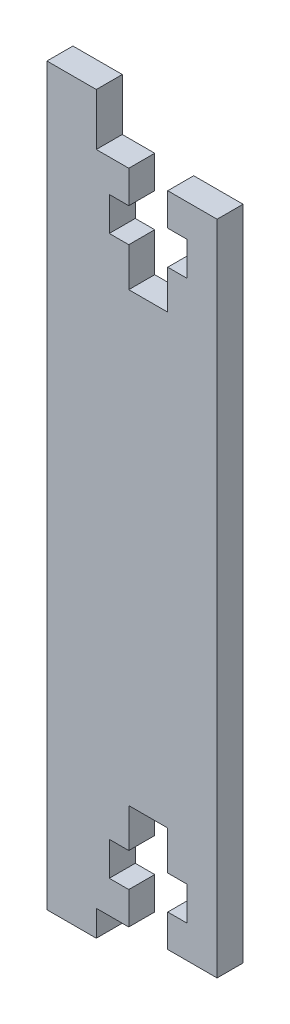
ISO-10303-21;
HEADER;
FILE_DESCRIPTION(('STEP AP214'),'2;1');
FILE_NAME('part.step','',(''),(''),'','','');
FILE_SCHEMA(('AUTOMOTIVE_DESIGN { 1 0 10303 214 1 1 1 1 }'));
ENDSEC;
DATA;
#1=APPLICATION_CONTEXT('core data for automotive mechanical design processes');
#2=APPLICATION_PROTOCOL_DEFINITION('international standard','automotive_design',2000,#1);
#3=PRODUCT_CONTEXT('',#1,'mechanical');
#4=PRODUCT('Part','Part','',(#3));
#5=PRODUCT_RELATED_PRODUCT_CATEGORY('part','',(#4));
#6=PRODUCT_DEFINITION_FORMATION('','',#4);
#7=PRODUCT_DEFINITION_CONTEXT('part definition',#1,'design');
#8=PRODUCT_DEFINITION('design','',#6,#7);
#9=PRODUCT_DEFINITION_SHAPE('','',#8);
#10=(LENGTH_UNIT() NAMED_UNIT(*) SI_UNIT(.MILLI.,.METRE.));
#11=(NAMED_UNIT(*) PLANE_ANGLE_UNIT() SI_UNIT($,.RADIAN.));
#12=(NAMED_UNIT(*) SI_UNIT($,.STERADIAN.) SOLID_ANGLE_UNIT());
#13=UNCERTAINTY_MEASURE_WITH_UNIT(LENGTH_MEASURE(1.E-05),#10,'distance_accuracy_value','');
#14=(GEOMETRIC_REPRESENTATION_CONTEXT(3) GLOBAL_UNCERTAINTY_ASSIGNED_CONTEXT((#13)) GLOBAL_UNIT_ASSIGNED_CONTEXT((#10,
#11,#12)) REPRESENTATION_CONTEXT('',''));
#15=CARTESIAN_POINT('',(0.,0.,0.));
#16=DIRECTION('',(0.,0.,1.));
#17=DIRECTION('',(1.,0.,0.));
#18=AXIS2_PLACEMENT_3D('',#15,#16,#17);
#19=CARTESIAN_POINT('',(-4.01714285714236,-28.1542857142857,2.));
#20=DIRECTION('',(0.,-1.,0.));
#21=DIRECTION('',(0.,0.,-1.));
#22=AXIS2_PLACEMENT_3D('',#19,#20,#21);
#23=PLANE('',#22);
#24=DIRECTION('',(-1.,0.,0.));
#25=VECTOR('',#24,1.);
#26=CARTESIAN_POINT('',(-4.01714285714236,-28.1542857142857,0.));
#27=LINE('',#26,#25);
#28=CARTESIAN_POINT('',(-4.01714285714236,-28.1542857142857,0.));
#29=VERTEX_POINT('',#28);
#30=CARTESIAN_POINT('',(-7.81714285714236,-28.1542857142857,0.));
#31=VERTEX_POINT('',#30);
#32=EDGE_CURVE('E356',#29,#31,#27,.T.);
#33=ORIENTED_EDGE('',*,*,#32,.F.);
#34=DIRECTION('',(0.,0.,-1.));
#35=VECTOR('',#34,1.);
#36=CARTESIAN_POINT('',(-4.01714285714236,-28.1542857142857,2.));
#37=LINE('',#36,#35);
#38=CARTESIAN_POINT('',(-4.01714285714236,-28.1542857142857,2.));
#39=VERTEX_POINT('',#38);
#40=EDGE_CURVE('E46',#39,#29,#37,.T.);
#41=ORIENTED_EDGE('',*,*,#40,.F.);
#42=DIRECTION('',(-1.,0.,0.));
#43=VECTOR('',#42,1.);
#44=CARTESIAN_POINT('',(-4.01714285714236,-28.1542857142857,2.));
#45=LINE('',#44,#43);
#46=CARTESIAN_POINT('',(-7.81714285714236,-28.1542857142857,2.));
#47=VERTEX_POINT('',#46);
#48=EDGE_CURVE('E256',#39,#47,#45,.T.);
#49=ORIENTED_EDGE('',*,*,#48,.T.);
#50=DIRECTION('',(0.,0.,-1.));
#51=VECTOR('',#50,1.);
#52=CARTESIAN_POINT('',(-7.81714285714236,-28.1542857142857,2.));
#53=LINE('',#52,#51);
#54=EDGE_CURVE('E11',#47,#31,#53,.T.);
#55=ORIENTED_EDGE('',*,*,#54,.T.);
#56=EDGE_LOOP('',(#33,#41,#49,#55));
#57=FACE_BOUND('',#56,.T.);
#58=ADVANCED_FACE('F36',(#57),#23,.T.);
#59=CARTESIAN_POINT('',(-4.01714285714236,-28.1542857142857,2.));
#60=DIRECTION('',(-1.,0.,0.));
#61=DIRECTION('',(0.,0.,1.));
#62=AXIS2_PLACEMENT_3D('',#59,#60,#61);
#63=PLANE('',#62);
#64=DIRECTION('',(0.,1.,0.));
#65=VECTOR('',#64,1.);
#66=CARTESIAN_POINT('',(-4.01714285714236,-28.1542857142857,0.));
#67=LINE('',#66,#65);
#68=CARTESIAN_POINT('',(-4.01714285714236,-26.1542857142857,0.));
#69=VERTEX_POINT('',#68);
#70=EDGE_CURVE('E261',#29,#69,#67,.T.);
#71=ORIENTED_EDGE('',*,*,#70,.T.);
#72=DIRECTION('',(0.,0.,-1.));
#73=VECTOR('',#72,1.);
#74=CARTESIAN_POINT('',(-4.01714285714236,-26.1542857142857,2.));
#75=LINE('',#74,#73);
#76=CARTESIAN_POINT('',(-4.01714285714236,-26.1542857142857,2.));
#77=VERTEX_POINT('',#76);
#78=EDGE_CURVE('E259',#77,#69,#75,.T.);
#79=ORIENTED_EDGE('',*,*,#78,.F.);
#80=DIRECTION('',(0.,1.,0.));
#81=VECTOR('',#80,1.);
#82=CARTESIAN_POINT('',(-4.01714285714236,-28.1542857142857,2.));
#83=LINE('',#82,#81);
#84=EDGE_CURVE('E248',#39,#77,#83,.T.);
#85=ORIENTED_EDGE('',*,*,#84,.F.);
#86=ORIENTED_EDGE('',*,*,#40,.T.);
#87=EDGE_LOOP('',(#71,#79,#85,#86));
#88=FACE_BOUND('',#87,.T.);
#89=ADVANCED_FACE('F260',(#88),#63,.F.);
#90=CARTESIAN_POINT('',(-4.01714285714236,-26.1542857142857,2.));
#91=DIRECTION('',(0.,1.,0.));
#92=DIRECTION('',(0.,0.,1.));
#93=AXIS2_PLACEMENT_3D('',#90,#91,#92);
#94=PLANE('',#93);
#95=DIRECTION('',(1.,0.,0.));
#96=VECTOR('',#95,1.);
#97=CARTESIAN_POINT('',(-4.01714285714236,-26.1542857142857,0.));
#98=LINE('',#97,#96);
#99=CARTESIAN_POINT('',(-1.51714285714233,-26.1542857142857,0.));
#100=VERTEX_POINT('',#99);
#101=EDGE_CURVE('E353',#69,#100,#98,.T.);
#102=ORIENTED_EDGE('',*,*,#101,.T.);
#103=DIRECTION('',(0.,0.,-1.));
#104=VECTOR('',#103,1.);
#105=CARTESIAN_POINT('',(-1.51714285714233,-26.1542857142857,2.));
#106=LINE('',#105,#104);
#107=CARTESIAN_POINT('',(-1.51714285714233,-26.1542857142857,2.));
#108=VERTEX_POINT('',#107);
#109=EDGE_CURVE('E265',#108,#100,#106,.T.);
#110=ORIENTED_EDGE('',*,*,#109,.F.);
#111=DIRECTION('',(1.,0.,0.));
#112=VECTOR('',#111,1.);
#113=CARTESIAN_POINT('',(-4.01714285714236,-26.1542857142857,2.));
#114=LINE('',#113,#112);
#115=EDGE_CURVE('E253',#77,#108,#114,.T.);
#116=ORIENTED_EDGE('',*,*,#115,.F.);
#117=ORIENTED_EDGE('',*,*,#78,.T.);
#118=EDGE_LOOP('',(#102,#110,#116,#117));
#119=FACE_BOUND('',#118,.T.);
#120=ADVANCED_FACE('F267',(#119),#94,.F.);
#121=CARTESIAN_POINT('',(-1.51714285714233,-23.6542857142861,2.));
#122=DIRECTION('',(1.,0.,0.));
#123=DIRECTION('',(0.,0.,-1.));
#124=AXIS2_PLACEMENT_3D('',#121,#122,#123);
#125=PLANE('',#124);
#126=DIRECTION('',(0.,-1.,0.));
#127=VECTOR('',#126,1.);
#128=CARTESIAN_POINT('',(-1.51714285714233,-23.6542857142861,0.));
#129=LINE('',#128,#127);
#130=CARTESIAN_POINT('',(-1.51714285714233,-23.6542857142861,0.));
#131=VERTEX_POINT('',#130);
#132=EDGE_CURVE('E350',#131,#100,#129,.T.);
#133=ORIENTED_EDGE('',*,*,#132,.F.);
#134=DIRECTION('',(0.,0.,-1.));
#135=VECTOR('',#134,1.);
#136=CARTESIAN_POINT('',(-1.51714285714233,-23.6542857142861,2.));
#137=LINE('',#136,#135);
#138=CARTESIAN_POINT('',(-1.51714285714233,-23.6542857142861,2.));
#139=VERTEX_POINT('',#138);
#140=EDGE_CURVE('E361',#139,#131,#137,.T.);
#141=ORIENTED_EDGE('',*,*,#140,.F.);
#142=DIRECTION('',(0.,-1.,0.));
#143=VECTOR('',#142,1.);
#144=CARTESIAN_POINT('',(-1.51714285714233,-23.6542857142861,2.));
#145=LINE('',#144,#143);
#146=EDGE_CURVE('E269',#139,#108,#145,.T.);
#147=ORIENTED_EDGE('',*,*,#146,.T.);
#148=ORIENTED_EDGE('',*,*,#109,.T.);
#149=EDGE_LOOP('',(#133,#141,#147,#148));
#150=FACE_BOUND('',#149,.T.);
#151=ADVANCED_FACE('F440',(#150),#125,.T.);
#152=CARTESIAN_POINT('',(-1.51714285714233,-23.6542857142861,2.));
#153=DIRECTION('',(0.,-1.,0.));
#154=DIRECTION('',(0.,0.,-1.));
#155=AXIS2_PLACEMENT_3D('',#152,#153,#154);
#156=PLANE('',#155);
#157=DIRECTION('',(-1.,0.,0.));
#158=VECTOR('',#157,1.);
#159=CARTESIAN_POINT('',(-1.51714285714233,-23.6542857142861,0.));
#160=LINE('',#159,#158);
#161=CARTESIAN_POINT('',(-3.01714285714222,-23.6542857142861,0.));
#162=VERTEX_POINT('',#161);
#163=EDGE_CURVE('E348',#131,#162,#160,.T.);
#164=ORIENTED_EDGE('',*,*,#163,.T.);
#165=DIRECTION('',(0.,0.,-1.));
#166=VECTOR('',#165,1.);
#167=CARTESIAN_POINT('',(-3.01714285714222,-23.6542857142861,2.));
#168=LINE('',#167,#166);
#169=CARTESIAN_POINT('',(-3.01714285714222,-23.6542857142861,2.));
#170=VERTEX_POINT('',#169);
#171=EDGE_CURVE('E363',#170,#162,#168,.T.);
#172=ORIENTED_EDGE('',*,*,#171,.F.);
#173=DIRECTION('',(-1.,0.,0.));
#174=VECTOR('',#173,1.);
#175=CARTESIAN_POINT('',(-1.51714285714233,-23.6542857142861,2.));
#176=LINE('',#175,#174);
#177=EDGE_CURVE('E271',#139,#170,#176,.T.);
#178=ORIENTED_EDGE('',*,*,#177,.F.);
#179=ORIENTED_EDGE('',*,*,#140,.T.);
#180=EDGE_LOOP('',(#164,#172,#178,#179));
#181=FACE_BOUND('',#180,.T.);
#182=ADVANCED_FACE('F443',(#181),#156,.F.);
#183=CARTESIAN_POINT('',(-3.01714285714222,-23.6542857142861,2.));
#184=DIRECTION('',(-1.,0.,0.));
#185=DIRECTION('',(0.,0.,1.));
#186=AXIS2_PLACEMENT_3D('',#183,#184,#185);
#187=PLANE('',#186);
#188=DIRECTION('',(0.,1.,0.));
#189=VECTOR('',#188,1.);
#190=CARTESIAN_POINT('',(-3.01714285714222,-23.6542857142861,0.));
#191=LINE('',#190,#189);
#192=CARTESIAN_POINT('',(-3.01714285714222,-21.0542857142854,0.));
#193=VERTEX_POINT('',#192);
#194=EDGE_CURVE('E346',#162,#193,#191,.T.);
#195=ORIENTED_EDGE('',*,*,#194,.T.);
#196=DIRECTION('',(0.,0.,-1.));
#197=VECTOR('',#196,1.);
#198=CARTESIAN_POINT('',(-3.01714285714222,-21.0542857142854,2.));
#199=LINE('',#198,#197);
#200=CARTESIAN_POINT('',(-3.01714285714222,-21.0542857142854,2.));
#201=VERTEX_POINT('',#200);
#202=EDGE_CURVE('E366',#201,#193,#199,.T.);
#203=ORIENTED_EDGE('',*,*,#202,.F.);
#204=DIRECTION('',(0.,1.,0.));
#205=VECTOR('',#204,1.);
#206=CARTESIAN_POINT('',(-3.01714285714222,-23.6542857142861,2.));
#207=LINE('',#206,#205);
#208=EDGE_CURVE('E853',#170,#201,#207,.T.);
#209=ORIENTED_EDGE('',*,*,#208,.F.);
#210=ORIENTED_EDGE('',*,*,#171,.T.);
#211=EDGE_LOOP('',(#195,#203,#209,#210));
#212=FACE_BOUND('',#211,.T.);
#213=ADVANCED_FACE('F447',(#212),#187,.F.);
#214=CARTESIAN_POINT('',(-3.01714285714222,-21.0542857142854,2.));
#215=DIRECTION('',(0.,1.,0.));
#216=DIRECTION('',(0.,0.,1.));
#217=AXIS2_PLACEMENT_3D('',#214,#215,#216);
#218=PLANE('',#217);
#219=DIRECTION('',(1.,0.,0.));
#220=VECTOR('',#219,1.);
#221=CARTESIAN_POINT('',(-3.01714285714222,-21.0542857142854,0.));
#222=LINE('',#221,#220);
#223=CARTESIAN_POINT('',(-1.51714285712806,-21.0542857142854,0.));
#224=VERTEX_POINT('',#223);
#225=EDGE_CURVE('E344',#193,#224,#222,.T.);
#226=ORIENTED_EDGE('',*,*,#225,.T.);
#227=DIRECTION('',(0.,0.,-1.));
#228=VECTOR('',#227,1.);
#229=CARTESIAN_POINT('',(-1.51714285712806,-21.0542857142854,2.));
#230=LINE('',#229,#228);
#231=CARTESIAN_POINT('',(-1.51714285712806,-21.0542857142854,2.));
#232=VERTEX_POINT('',#231);
#233=EDGE_CURVE('E369',#232,#224,#230,.T.);
#234=ORIENTED_EDGE('',*,*,#233,.F.);
#235=DIRECTION('',(1.,0.,0.));
#236=VECTOR('',#235,1.);
#237=CARTESIAN_POINT('',(-3.01714285714222,-21.0542857142854,2.));
#238=LINE('',#237,#236);
#239=EDGE_CURVE('E850',#201,#232,#238,.T.);
#240=ORIENTED_EDGE('',*,*,#239,.F.);
#241=ORIENTED_EDGE('',*,*,#202,.T.);
#242=EDGE_LOOP('',(#226,#234,#240,#241));
#243=FACE_BOUND('',#242,.T.);
#244=ADVANCED_FACE('F451',(#243),#218,.F.);
#245=CARTESIAN_POINT('',(-1.51714285712806,-21.0542857142854,2.));
#246=DIRECTION('',(-1.,0.,0.));
#247=DIRECTION('',(0.,0.,1.));
#248=AXIS2_PLACEMENT_3D('',#245,#246,#247);
#249=PLANE('',#248);
#250=DIRECTION('',(0.,1.,0.));
#251=VECTOR('',#250,1.);
#252=CARTESIAN_POINT('',(-1.51714285712806,-21.0542857142854,0.));
#253=LINE('',#252,#251);
#254=CARTESIAN_POINT('',(-1.51714285712806,-18.0542857142858,0.));
#255=VERTEX_POINT('',#254);
#256=EDGE_CURVE('E342',#224,#255,#253,.T.);
#257=ORIENTED_EDGE('',*,*,#256,.T.);
#258=DIRECTION('',(0.,0.,-1.));
#259=VECTOR('',#258,1.);
#260=CARTESIAN_POINT('',(-1.51714285712806,-18.0542857142858,2.));
#261=LINE('',#260,#259);
#262=CARTESIAN_POINT('',(-1.51714285712806,-18.0542857142858,2.));
#263=VERTEX_POINT('',#262);
#264=EDGE_CURVE('E372',#263,#255,#261,.T.);
#265=ORIENTED_EDGE('',*,*,#264,.F.);
#266=DIRECTION('',(0.,1.,0.));
#267=VECTOR('',#266,1.);
#268=CARTESIAN_POINT('',(-1.51714285712806,-21.0542857142854,2.));
#269=LINE('',#268,#267);
#270=EDGE_CURVE('E848',#232,#263,#269,.T.);
#271=ORIENTED_EDGE('',*,*,#270,.F.);
#272=ORIENTED_EDGE('',*,*,#233,.T.);
#273=EDGE_LOOP('',(#257,#265,#271,#272));
#274=FACE_BOUND('',#273,.T.);
#275=ADVANCED_FACE('F455',(#274),#249,.F.);
#276=CARTESIAN_POINT('',(-1.51714285712806,-18.0542857142858,2.));
#277=DIRECTION('',(0.,1.,0.));
#278=DIRECTION('',(0.,0.,1.));
#279=AXIS2_PLACEMENT_3D('',#276,#277,#278);
#280=PLANE('',#279);
#281=DIRECTION('',(1.,0.,0.));
#282=VECTOR('',#281,1.);
#283=CARTESIAN_POINT('',(-1.51714285712806,-18.0542857142858,0.));
#284=LINE('',#283,#282);
#285=CARTESIAN_POINT('',(1.48285714284341,-18.0542857142858,0.));
#286=VERTEX_POINT('',#285);
#287=EDGE_CURVE('E339',#255,#286,#284,.T.);
#288=ORIENTED_EDGE('',*,*,#287,.T.);
#289=DIRECTION('',(0.,0.,-1.));
#290=VECTOR('',#289,1.);
#291=CARTESIAN_POINT('',(1.48285714284341,-18.0542857142858,2.));
#292=LINE('',#291,#290);
#293=CARTESIAN_POINT('',(1.48285714284341,-18.0542857142858,2.));
#294=VERTEX_POINT('',#293);
#295=EDGE_CURVE('E375',#294,#286,#292,.T.);
#296=ORIENTED_EDGE('',*,*,#295,.F.);
#297=DIRECTION('',(1.,0.,0.));
#298=VECTOR('',#297,1.);
#299=CARTESIAN_POINT('',(-1.51714285712806,-18.0542857142858,2.));
#300=LINE('',#299,#298);
#301=EDGE_CURVE('E862',#263,#294,#300,.T.);
#302=ORIENTED_EDGE('',*,*,#301,.F.);
#303=ORIENTED_EDGE('',*,*,#264,.T.);
#304=EDGE_LOOP('',(#288,#296,#302,#303));
#305=FACE_BOUND('',#304,.T.);
#306=ADVANCED_FACE('F459',(#305),#280,.F.);
#307=CARTESIAN_POINT('',(1.48285714284341,-21.0542857142863,2.));
#308=DIRECTION('',(-1.,0.,0.));
#309=DIRECTION('',(0.,0.,1.));
#310=AXIS2_PLACEMENT_3D('',#307,#308,#309);
#311=PLANE('',#310);
#312=DIRECTION('',(0.,1.,0.));
#313=VECTOR('',#312,1.);
#314=CARTESIAN_POINT('',(1.48285714284341,-21.0542857142863,0.));
#315=LINE('',#314,#313);
#316=CARTESIAN_POINT('',(1.48285714284341,-21.0542857142863,0.));
#317=VERTEX_POINT('',#316);
#318=EDGE_CURVE('E336',#317,#286,#315,.T.);
#319=ORIENTED_EDGE('',*,*,#318,.F.);
#320=DIRECTION('',(0.,0.,-1.));
#321=VECTOR('',#320,1.);
#322=CARTESIAN_POINT('',(1.48285714284341,-21.0542857142863,2.));
#323=LINE('',#322,#321);
#324=CARTESIAN_POINT('',(1.48285714284341,-21.0542857142863,2.));
#325=VERTEX_POINT('',#324);
#326=EDGE_CURVE('E377',#325,#317,#323,.T.);
#327=ORIENTED_EDGE('',*,*,#326,.F.);
#328=DIRECTION('',(0.,1.,0.));
#329=VECTOR('',#328,1.);
#330=CARTESIAN_POINT('',(1.48285714284341,-21.0542857142863,2.));
#331=LINE('',#330,#329);
#332=EDGE_CURVE('E840',#325,#294,#331,.T.);
#333=ORIENTED_EDGE('',*,*,#332,.T.);
#334=ORIENTED_EDGE('',*,*,#295,.T.);
#335=EDGE_LOOP('',(#319,#327,#333,#334));
#336=FACE_BOUND('',#335,.T.);
#337=ADVANCED_FACE('F463',(#336),#311,.T.);
#338=CARTESIAN_POINT('',(2.98285714285637,-21.0542857142863,2.));
#339=DIRECTION('',(0.,-1.,0.));
#340=DIRECTION('',(0.,0.,-1.));
#341=AXIS2_PLACEMENT_3D('',#338,#339,#340);
#342=PLANE('',#341);
#343=DIRECTION('',(-1.,0.,0.));
#344=VECTOR('',#343,1.);
#345=CARTESIAN_POINT('',(2.98285714285637,-21.0542857142863,0.));
#346=LINE('',#345,#344);
#347=CARTESIAN_POINT('',(2.98285714285637,-21.0542857142863,0.));
#348=VERTEX_POINT('',#347);
#349=EDGE_CURVE('E333',#348,#317,#346,.T.);
#350=ORIENTED_EDGE('',*,*,#349,.F.);
#351=DIRECTION('',(0.,0.,-1.));
#352=VECTOR('',#351,1.);
#353=CARTESIAN_POINT('',(2.98285714285637,-21.0542857142863,2.));
#354=LINE('',#353,#352);
#355=CARTESIAN_POINT('',(2.98285714285637,-21.0542857142863,2.));
#356=VERTEX_POINT('',#355);
#357=EDGE_CURVE('E379',#356,#348,#354,.T.);
#358=ORIENTED_EDGE('',*,*,#357,.F.);
#359=DIRECTION('',(-1.,0.,0.));
#360=VECTOR('',#359,1.);
#361=CARTESIAN_POINT('',(2.98285714285637,-21.0542857142863,2.));
#362=LINE('',#361,#360);
#363=EDGE_CURVE('E836',#356,#325,#362,.T.);
#364=ORIENTED_EDGE('',*,*,#363,.T.);
#365=ORIENTED_EDGE('',*,*,#326,.T.);
#366=EDGE_LOOP('',(#350,#358,#364,#365));
#367=FACE_BOUND('',#366,.T.);
#368=ADVANCED_FACE('F467',(#367),#342,.T.);
#369=CARTESIAN_POINT('',(2.98285714285637,-23.6542857142861,2.));
#370=DIRECTION('',(-1.,0.,0.));
#371=DIRECTION('',(0.,0.,1.));
#372=AXIS2_PLACEMENT_3D('',#369,#370,#371);
#373=PLANE('',#372);
#374=DIRECTION('',(0.,1.,0.));
#375=VECTOR('',#374,1.);
#376=CARTESIAN_POINT('',(2.98285714285637,-23.6542857142861,0.));
#377=LINE('',#376,#375);
#378=CARTESIAN_POINT('',(2.98285714285637,-23.6542857142861,0.));
#379=VERTEX_POINT('',#378);
#380=EDGE_CURVE('E330',#379,#348,#377,.T.);
#381=ORIENTED_EDGE('',*,*,#380,.F.);
#382=DIRECTION('',(0.,0.,-1.));
#383=VECTOR('',#382,1.);
#384=CARTESIAN_POINT('',(2.98285714285637,-23.6542857142861,2.));
#385=LINE('',#384,#383);
#386=CARTESIAN_POINT('',(2.98285714285637,-23.6542857142861,2.));
#387=VERTEX_POINT('',#386);
#388=EDGE_CURVE('E381',#387,#379,#385,.T.);
#389=ORIENTED_EDGE('',*,*,#388,.F.);
#390=DIRECTION('',(0.,1.,0.));
#391=VECTOR('',#390,1.);
#392=CARTESIAN_POINT('',(2.98285714285637,-23.6542857142861,2.));
#393=LINE('',#392,#391);
#394=EDGE_CURVE('E866',#387,#356,#393,.T.);
#395=ORIENTED_EDGE('',*,*,#394,.T.);
#396=ORIENTED_EDGE('',*,*,#357,.T.);
#397=EDGE_LOOP('',(#381,#389,#395,#396));
#398=FACE_BOUND('',#397,.T.);
#399=ADVANCED_FACE('F471',(#398),#373,.T.);
#400=CARTESIAN_POINT('',(1.48285714284341,-23.6542857142861,2.));
#401=DIRECTION('',(0.,1.,0.));
#402=DIRECTION('',(0.,0.,1.));
#403=AXIS2_PLACEMENT_3D('',#400,#401,#402);
#404=PLANE('',#403);
#405=DIRECTION('',(1.,0.,0.));
#406=VECTOR('',#405,1.);
#407=CARTESIAN_POINT('',(1.48285714284341,-23.6542857142861,0.));
#408=LINE('',#407,#406);
#409=CARTESIAN_POINT('',(1.48285714284341,-23.6542857142861,0.));
#410=VERTEX_POINT('',#409);
#411=EDGE_CURVE('E327',#410,#379,#408,.T.);
#412=ORIENTED_EDGE('',*,*,#411,.F.);
#413=DIRECTION('',(0.,0.,-1.));
#414=VECTOR('',#413,1.);
#415=CARTESIAN_POINT('',(1.48285714284341,-23.6542857142861,2.));
#416=LINE('',#415,#414);
#417=CARTESIAN_POINT('',(1.48285714284341,-23.6542857142861,2.));
#418=VERTEX_POINT('',#417);
#419=EDGE_CURVE('E383',#418,#410,#416,.T.);
#420=ORIENTED_EDGE('',*,*,#419,.F.);
#421=DIRECTION('',(1.,0.,0.));
#422=VECTOR('',#421,1.);
#423=CARTESIAN_POINT('',(1.48285714284341,-23.6542857142861,2.));
#424=LINE('',#423,#422);
#425=EDGE_CURVE('E828',#418,#387,#424,.T.);
#426=ORIENTED_EDGE('',*,*,#425,.T.);
#427=ORIENTED_EDGE('',*,*,#388,.T.);
#428=EDGE_LOOP('',(#412,#420,#426,#427));
#429=FACE_BOUND('',#428,.T.);
#430=ADVANCED_FACE('F475',(#429),#404,.T.);
#431=CARTESIAN_POINT('',(1.48285714284341,-26.1542857142857,2.));
#432=DIRECTION('',(-1.,0.,0.));
#433=DIRECTION('',(0.,0.,1.));
#434=AXIS2_PLACEMENT_3D('',#431,#432,#433);
#435=PLANE('',#434);
#436=DIRECTION('',(0.,1.,0.));
#437=VECTOR('',#436,1.);
#438=CARTESIAN_POINT('',(1.48285714284341,-26.1542857142857,0.));
#439=LINE('',#438,#437);
#440=CARTESIAN_POINT('',(1.48285714284341,-26.1542857142857,0.));
#441=VERTEX_POINT('',#440);
#442=EDGE_CURVE('E324',#441,#410,#439,.T.);
#443=ORIENTED_EDGE('',*,*,#442,.F.);
#444=DIRECTION('',(0.,0.,-1.));
#445=VECTOR('',#444,1.);
#446=CARTESIAN_POINT('',(1.48285714284341,-26.1542857142857,2.));
#447=LINE('',#446,#445);
#448=CARTESIAN_POINT('',(1.48285714284341,-26.1542857142857,2.));
#449=VERTEX_POINT('',#448);
#450=EDGE_CURVE('E385',#449,#441,#447,.T.);
#451=ORIENTED_EDGE('',*,*,#450,.F.);
#452=DIRECTION('',(0.,1.,0.));
#453=VECTOR('',#452,1.);
#454=CARTESIAN_POINT('',(1.48285714284341,-26.1542857142857,2.));
#455=LINE('',#454,#453);
#456=EDGE_CURVE('E824',#449,#418,#455,.T.);
#457=ORIENTED_EDGE('',*,*,#456,.T.);
#458=ORIENTED_EDGE('',*,*,#419,.T.);
#459=EDGE_LOOP('',(#443,#451,#457,#458));
#460=FACE_BOUND('',#459,.T.);
#461=ADVANCED_FACE('F479',(#460),#435,.T.);
#462=CARTESIAN_POINT('',(5.2828571428567,-26.1542857142857,2.));
#463=DIRECTION('',(0.,-1.,0.));
#464=DIRECTION('',(0.,0.,-1.));
#465=AXIS2_PLACEMENT_3D('',#462,#463,#464);
#466=PLANE('',#465);
#467=DIRECTION('',(-1.,0.,0.));
#468=VECTOR('',#467,1.);
#469=CARTESIAN_POINT('',(5.2828571428567,-26.1542857142857,0.));
#470=LINE('',#469,#468);
#471=CARTESIAN_POINT('',(5.2828571428567,-26.1542857142857,0.));
#472=VERTEX_POINT('',#471);
#473=EDGE_CURVE('E321',#472,#441,#470,.T.);
#474=ORIENTED_EDGE('',*,*,#473,.F.);
#475=DIRECTION('',(0.,0.,-1.));
#476=VECTOR('',#475,1.);
#477=CARTESIAN_POINT('',(5.2828571428567,-26.1542857142857,2.));
#478=LINE('',#477,#476);
#479=CARTESIAN_POINT('',(5.2828571428567,-26.1542857142857,2.));
#480=VERTEX_POINT('',#479);
#481=EDGE_CURVE('E387',#480,#472,#478,.T.);
#482=ORIENTED_EDGE('',*,*,#481,.F.);
#483=DIRECTION('',(-1.,0.,0.));
#484=VECTOR('',#483,1.);
#485=CARTESIAN_POINT('',(5.2828571428567,-26.1542857142857,2.));
#486=LINE('',#485,#484);
#487=EDGE_CURVE('E819',#480,#449,#486,.T.);
#488=ORIENTED_EDGE('',*,*,#487,.T.);
#489=ORIENTED_EDGE('',*,*,#450,.T.);
#490=EDGE_LOOP('',(#474,#482,#488,#489));
#491=FACE_BOUND('',#490,.T.);
#492=ADVANCED_FACE('F483',(#491),#466,.T.);
#493=CARTESIAN_POINT('',(5.2828571428567,-26.1542857142857,2.));
#494=DIRECTION('',(-1.,0.,0.));
#495=DIRECTION('',(0.,0.,1.));
#496=AXIS2_PLACEMENT_3D('',#493,#494,#495);
#497=PLANE('',#496);
#498=DIRECTION('',(0.,1.,0.));
#499=VECTOR('',#498,1.);
#500=CARTESIAN_POINT('',(5.2828571428567,-26.1542857142857,0.));
#501=LINE('',#500,#499);
#502=CARTESIAN_POINT('',(5.2828571428567,24.4457142857143,0.));
#503=VERTEX_POINT('',#502);
#504=EDGE_CURVE('E318',#472,#503,#501,.T.);
#505=ORIENTED_EDGE('',*,*,#504,.T.);
#506=DIRECTION('',(0.,0.,-1.));
#507=VECTOR('',#506,1.);
#508=CARTESIAN_POINT('',(5.2828571428567,24.4457142857143,2.));
#509=LINE('',#508,#507);
#510=CARTESIAN_POINT('',(5.2828571428567,24.4457142857143,2.));
#511=VERTEX_POINT('',#510);
#512=EDGE_CURVE('E389',#511,#503,#509,.T.);
#513=ORIENTED_EDGE('',*,*,#512,.F.);
#514=DIRECTION('',(0.,1.,0.));
#515=VECTOR('',#514,1.);
#516=CARTESIAN_POINT('',(5.2828571428567,-26.1542857142857,2.));
#517=LINE('',#516,#515);
#518=EDGE_CURVE('E816',#480,#511,#517,.T.);
#519=ORIENTED_EDGE('',*,*,#518,.F.);
#520=ORIENTED_EDGE('',*,*,#481,.T.);
#521=EDGE_LOOP('',(#505,#513,#519,#520));
#522=FACE_BOUND('',#521,.T.);
#523=ADVANCED_FACE('F487',(#522),#497,.F.);
#524=CARTESIAN_POINT('',(1.4828571428567,24.4457142857143,2.));
#525=DIRECTION('',(0.,1.,0.));
#526=DIRECTION('',(0.,0.,1.));
#527=AXIS2_PLACEMENT_3D('',#524,#525,#526);
#528=PLANE('',#527);
#529=DIRECTION('',(1.,0.,0.));
#530=VECTOR('',#529,1.);
#531=CARTESIAN_POINT('',(1.4828571428567,24.4457142857143,0.));
#532=LINE('',#531,#530);
#533=CARTESIAN_POINT('',(1.4828571428567,24.4457142857143,0.));
#534=VERTEX_POINT('',#533);
#535=EDGE_CURVE('E315',#534,#503,#532,.T.);
#536=ORIENTED_EDGE('',*,*,#535,.F.);
#537=DIRECTION('',(0.,0.,-1.));
#538=VECTOR('',#537,1.);
#539=CARTESIAN_POINT('',(1.4828571428567,24.4457142857143,2.));
#540=LINE('',#539,#538);
#541=CARTESIAN_POINT('',(1.4828571428567,24.4457142857143,2.));
#542=VERTEX_POINT('',#541);
#543=EDGE_CURVE('E391',#542,#534,#540,.T.);
#544=ORIENTED_EDGE('',*,*,#543,.F.);
#545=DIRECTION('',(1.,0.,0.));
#546=VECTOR('',#545,1.);
#547=CARTESIAN_POINT('',(1.4828571428567,24.4457142857143,2.));
#548=LINE('',#547,#546);
#549=EDGE_CURVE('E814',#542,#511,#548,.T.);
#550=ORIENTED_EDGE('',*,*,#549,.T.);
#551=ORIENTED_EDGE('',*,*,#512,.T.);
#552=EDGE_LOOP('',(#536,#544,#550,#551));
#553=FACE_BOUND('',#552,.T.);
#554=ADVANCED_FACE('F491',(#553),#528,.T.);
#555=CARTESIAN_POINT('',(1.4828571428567,21.9457142857147,2.));
#556=DIRECTION('',(-1.,0.,0.));
#557=DIRECTION('',(0.,0.,1.));
#558=AXIS2_PLACEMENT_3D('',#555,#556,#557);
#559=PLANE('',#558);
#560=DIRECTION('',(0.,1.,0.));
#561=VECTOR('',#560,1.);
#562=CARTESIAN_POINT('',(1.4828571428567,21.9457142857147,0.));
#563=LINE('',#562,#561);
#564=CARTESIAN_POINT('',(1.4828571428567,21.9457142857147,0.));
#565=VERTEX_POINT('',#564);
#566=EDGE_CURVE('E312',#565,#534,#563,.T.);
#567=ORIENTED_EDGE('',*,*,#566,.F.);
#568=DIRECTION('',(0.,0.,-1.));
#569=VECTOR('',#568,1.);
#570=CARTESIAN_POINT('',(1.4828571428567,21.9457142857147,2.));
#571=LINE('',#570,#569);
#572=CARTESIAN_POINT('',(1.4828571428567,21.9457142857147,2.));
#573=VERTEX_POINT('',#572);
#574=EDGE_CURVE('E393',#573,#565,#571,.T.);
#575=ORIENTED_EDGE('',*,*,#574,.F.);
#576=DIRECTION('',(0.,1.,0.));
#577=VECTOR('',#576,1.);
#578=CARTESIAN_POINT('',(1.4828571428567,21.9457142857147,2.));
#579=LINE('',#578,#577);
#580=EDGE_CURVE('E807',#573,#542,#579,.T.);
#581=ORIENTED_EDGE('',*,*,#580,.T.);
#582=ORIENTED_EDGE('',*,*,#543,.T.);
#583=EDGE_LOOP('',(#567,#575,#581,#582));
#584=FACE_BOUND('',#583,.T.);
#585=ADVANCED_FACE('F495',(#584),#559,.T.);
#586=CARTESIAN_POINT('',(1.4828571428567,21.9457142857147,2.));
#587=DIRECTION('',(0.,1.,0.));
#588=DIRECTION('',(0.,0.,1.));
#589=AXIS2_PLACEMENT_3D('',#586,#587,#588);
#590=PLANE('',#589);
#591=DIRECTION('',(1.,0.,0.));
#592=VECTOR('',#591,1.);
#593=CARTESIAN_POINT('',(1.4828571428567,21.9457142857147,0.));
#594=LINE('',#593,#592);
#595=CARTESIAN_POINT('',(2.98285714285636,21.9457142857147,0.));
#596=VERTEX_POINT('',#595);
#597=EDGE_CURVE('E310',#565,#596,#594,.T.);
#598=ORIENTED_EDGE('',*,*,#597,.T.);
#599=DIRECTION('',(0.,0.,-1.));
#600=VECTOR('',#599,1.);
#601=CARTESIAN_POINT('',(2.98285714285636,21.9457142857147,2.));
#602=LINE('',#601,#600);
#603=CARTESIAN_POINT('',(2.98285714285636,21.9457142857147,2.));
#604=VERTEX_POINT('',#603);
#605=EDGE_CURVE('E395',#604,#596,#602,.T.);
#606=ORIENTED_EDGE('',*,*,#605,.F.);
#607=DIRECTION('',(1.,0.,0.));
#608=VECTOR('',#607,1.);
#609=CARTESIAN_POINT('',(1.4828571428567,21.9457142857147,2.));
#610=LINE('',#609,#608);
#611=EDGE_CURVE('E804',#573,#604,#610,.T.);
#612=ORIENTED_EDGE('',*,*,#611,.F.);
#613=ORIENTED_EDGE('',*,*,#574,.T.);
#614=EDGE_LOOP('',(#598,#606,#612,#613));
#615=FACE_BOUND('',#614,.T.);
#616=ADVANCED_FACE('F499',(#615),#590,.F.);
#617=CARTESIAN_POINT('',(2.98285714285636,21.9457142857147,2.));
#618=DIRECTION('',(1.,0.,0.));
#619=DIRECTION('',(0.,1.,0.));
#620=AXIS2_PLACEMENT_3D('',#617,#618,#619);
#621=PLANE('',#620);
#622=DIRECTION('',(0.,-1.,0.));
#623=VECTOR('',#622,1.);
#624=CARTESIAN_POINT('',(2.98285714285636,21.9457142857147,0.));
#625=LINE('',#624,#623);
#626=CARTESIAN_POINT('',(2.98285714285637,19.3457142857149,0.));
#627=VERTEX_POINT('',#626);
#628=EDGE_CURVE('E308',#596,#627,#625,.T.);
#629=ORIENTED_EDGE('',*,*,#628,.T.);
#630=DIRECTION('',(0.,0.,-1.));
#631=VECTOR('',#630,1.);
#632=CARTESIAN_POINT('',(2.98285714285637,19.3457142857149,2.));
#633=LINE('',#632,#631);
#634=CARTESIAN_POINT('',(2.98285714285637,19.3457142857149,2.));
#635=VERTEX_POINT('',#634);
#636=EDGE_CURVE('E398',#635,#627,#633,.T.);
#637=ORIENTED_EDGE('',*,*,#636,.F.);
#638=DIRECTION('',(0.,-1.,0.));
#639=VECTOR('',#638,1.);
#640=CARTESIAN_POINT('',(2.98285714285636,21.9457142857147,2.));
#641=LINE('',#640,#639);
#642=EDGE_CURVE('E802',#604,#635,#641,.T.);
#643=ORIENTED_EDGE('',*,*,#642,.F.);
#644=ORIENTED_EDGE('',*,*,#605,.T.);
#645=EDGE_LOOP('',(#629,#637,#643,#644));
#646=FACE_BOUND('',#645,.T.);
#647=ADVANCED_FACE('F503',(#646),#621,.F.);
#648=CARTESIAN_POINT('',(2.98285714285637,19.3457142857149,2.));
#649=DIRECTION('',(0.,-1.,0.));
#650=DIRECTION('',(0.,0.,-1.));
#651=AXIS2_PLACEMENT_3D('',#648,#649,#650);
#652=PLANE('',#651);
#653=DIRECTION('',(-1.,0.,0.));
#654=VECTOR('',#653,1.);
#655=CARTESIAN_POINT('',(2.98285714285637,19.3457142857149,0.));
#656=LINE('',#655,#654);
#657=CARTESIAN_POINT('',(1.48285714284341,19.3457142857149,0.));
#658=VERTEX_POINT('',#657);
#659=EDGE_CURVE('E306',#627,#658,#656,.T.);
#660=ORIENTED_EDGE('',*,*,#659,.T.);
#661=DIRECTION('',(0.,0.,-1.));
#662=VECTOR('',#661,1.);
#663=CARTESIAN_POINT('',(1.48285714284341,19.3457142857149,2.));
#664=LINE('',#663,#662);
#665=CARTESIAN_POINT('',(1.48285714284341,19.3457142857149,2.));
#666=VERTEX_POINT('',#665);
#667=EDGE_CURVE('E401',#666,#658,#664,.T.);
#668=ORIENTED_EDGE('',*,*,#667,.F.);
#669=DIRECTION('',(-1.,0.,0.));
#670=VECTOR('',#669,1.);
#671=CARTESIAN_POINT('',(2.98285714285637,19.3457142857149,2.));
#672=LINE('',#671,#670);
#673=EDGE_CURVE('E795',#635,#666,#672,.T.);
#674=ORIENTED_EDGE('',*,*,#673,.F.);
#675=ORIENTED_EDGE('',*,*,#636,.T.);
#676=EDGE_LOOP('',(#660,#668,#674,#675));
#677=FACE_BOUND('',#676,.T.);
#678=ADVANCED_FACE('F507',(#677),#652,.F.);
#679=CARTESIAN_POINT('',(1.48285714284341,19.3457142857149,2.));
#680=DIRECTION('',(1.,0.,0.));
#681=DIRECTION('',(0.,0.,-1.));
#682=AXIS2_PLACEMENT_3D('',#679,#680,#681);
#683=PLANE('',#682);
#684=DIRECTION('',(0.,-1.,0.));
#685=VECTOR('',#684,1.);
#686=CARTESIAN_POINT('',(1.48285714284341,19.3457142857149,0.));
#687=LINE('',#686,#685);
#688=CARTESIAN_POINT('',(1.48285714284341,16.3457142857145,0.));
#689=VERTEX_POINT('',#688);
#690=EDGE_CURVE('E303',#658,#689,#687,.T.);
#691=ORIENTED_EDGE('',*,*,#690,.T.);
#692=DIRECTION('',(0.,0.,-1.));
#693=VECTOR('',#692,1.);
#694=CARTESIAN_POINT('',(1.48285714284341,16.3457142857145,2.));
#695=LINE('',#694,#693);
#696=CARTESIAN_POINT('',(1.48285714284341,16.3457142857145,2.));
#697=VERTEX_POINT('',#696);
#698=EDGE_CURVE('E404',#697,#689,#695,.T.);
#699=ORIENTED_EDGE('',*,*,#698,.F.);
#700=DIRECTION('',(0.,-1.,0.));
#701=VECTOR('',#700,1.);
#702=CARTESIAN_POINT('',(1.48285714284341,19.3457142857149,2.));
#703=LINE('',#702,#701);
#704=EDGE_CURVE('E793',#666,#697,#703,.T.);
#705=ORIENTED_EDGE('',*,*,#704,.F.);
#706=ORIENTED_EDGE('',*,*,#667,.T.);
#707=EDGE_LOOP('',(#691,#699,#705,#706));
#708=FACE_BOUND('',#707,.T.);
#709=ADVANCED_FACE('F511',(#708),#683,.F.);
#710=CARTESIAN_POINT('',(-1.51714285712806,16.3457142857145,2.));
#711=DIRECTION('',(0.,1.,0.));
#712=DIRECTION('',(-1.,0.,0.));
#713=AXIS2_PLACEMENT_3D('',#710,#711,#712);
#714=PLANE('',#713);
#715=DIRECTION('',(1.,0.,0.));
#716=VECTOR('',#715,1.);
#717=CARTESIAN_POINT('',(-1.51714285712806,16.3457142857145,0.));
#718=LINE('',#717,#716);
#719=CARTESIAN_POINT('',(-1.51714285712806,16.3457142857145,0.));
#720=VERTEX_POINT('',#719);
#721=EDGE_CURVE('E300',#720,#689,#718,.T.);
#722=ORIENTED_EDGE('',*,*,#721,.F.);
#723=DIRECTION('',(0.,0.,-1.));
#724=VECTOR('',#723,1.);
#725=CARTESIAN_POINT('',(-1.51714285712806,16.3457142857145,2.));
#726=LINE('',#725,#724);
#727=CARTESIAN_POINT('',(-1.51714285712806,16.3457142857145,2.));
#728=VERTEX_POINT('',#727);
#729=EDGE_CURVE('E406',#728,#720,#726,.T.);
#730=ORIENTED_EDGE('',*,*,#729,.F.);
#731=DIRECTION('',(1.,0.,0.));
#732=VECTOR('',#731,1.);
#733=CARTESIAN_POINT('',(-1.51714285712806,16.3457142857145,2.));
#734=LINE('',#733,#732);
#735=EDGE_CURVE('E790',#728,#697,#734,.T.);
#736=ORIENTED_EDGE('',*,*,#735,.T.);
#737=ORIENTED_EDGE('',*,*,#698,.T.);
#738=EDGE_LOOP('',(#722,#730,#736,#737));
#739=FACE_BOUND('',#738,.T.);
#740=ADVANCED_FACE('F515',(#739),#714,.T.);
#741=CARTESIAN_POINT('',(-1.51714285712806,19.345714285714,2.));
#742=DIRECTION('',(1.,0.,0.));
#743=DIRECTION('',(0.,0.,-1.));
#744=AXIS2_PLACEMENT_3D('',#741,#742,#743);
#745=PLANE('',#744);
#746=DIRECTION('',(0.,-1.,0.));
#747=VECTOR('',#746,1.);
#748=CARTESIAN_POINT('',(-1.51714285712806,19.345714285714,0.));
#749=LINE('',#748,#747);
#750=CARTESIAN_POINT('',(-1.51714285712806,19.345714285714,0.));
#751=VERTEX_POINT('',#750);
#752=EDGE_CURVE('E297',#751,#720,#749,.T.);
#753=ORIENTED_EDGE('',*,*,#752,.F.);
#754=DIRECTION('',(0.,0.,-1.));
#755=VECTOR('',#754,1.);
#756=CARTESIAN_POINT('',(-1.51714285712806,19.345714285714,2.));
#757=LINE('',#756,#755);
#758=CARTESIAN_POINT('',(-1.51714285712806,19.345714285714,2.));
#759=VERTEX_POINT('',#758);
#760=EDGE_CURVE('E408',#759,#751,#757,.T.);
#761=ORIENTED_EDGE('',*,*,#760,.F.);
#762=DIRECTION('',(0.,-1.,0.));
#763=VECTOR('',#762,1.);
#764=CARTESIAN_POINT('',(-1.51714285712806,19.345714285714,2.));
#765=LINE('',#764,#763);
#766=EDGE_CURVE('E879',#759,#728,#765,.T.);
#767=ORIENTED_EDGE('',*,*,#766,.T.);
#768=ORIENTED_EDGE('',*,*,#729,.T.);
#769=EDGE_LOOP('',(#753,#761,#767,#768));
#770=FACE_BOUND('',#769,.T.);
#771=ADVANCED_FACE('F519',(#770),#745,.T.);
#772=CARTESIAN_POINT('',(-3.01714285714222,19.345714285714,2.));
#773=DIRECTION('',(0.,1.,0.));
#774=DIRECTION('',(0.,0.,1.));
#775=AXIS2_PLACEMENT_3D('',#772,#773,#774);
#776=PLANE('',#775);
#777=DIRECTION('',(1.,0.,0.));
#778=VECTOR('',#777,1.);
#779=CARTESIAN_POINT('',(-3.01714285714222,19.345714285714,0.));
#780=LINE('',#779,#778);
#781=CARTESIAN_POINT('',(-3.01714285714222,19.345714285714,0.));
#782=VERTEX_POINT('',#781);
#783=EDGE_CURVE('E294',#782,#751,#780,.T.);
#784=ORIENTED_EDGE('',*,*,#783,.F.);
#785=DIRECTION('',(0.,0.,-1.));
#786=VECTOR('',#785,1.);
#787=CARTESIAN_POINT('',(-3.01714285714222,19.345714285714,2.));
#788=LINE('',#787,#786);
#789=CARTESIAN_POINT('',(-3.01714285714222,19.345714285714,2.));
#790=VERTEX_POINT('',#789);
#791=EDGE_CURVE('E410',#790,#782,#788,.T.);
#792=ORIENTED_EDGE('',*,*,#791,.F.);
#793=DIRECTION('',(1.,0.,0.));
#794=VECTOR('',#793,1.);
#795=CARTESIAN_POINT('',(-3.01714285714222,19.345714285714,2.));
#796=LINE('',#795,#794);
#797=EDGE_CURVE('E781',#790,#759,#796,.T.);
#798=ORIENTED_EDGE('',*,*,#797,.T.);
#799=ORIENTED_EDGE('',*,*,#760,.T.);
#800=EDGE_LOOP('',(#784,#792,#798,#799));
#801=FACE_BOUND('',#800,.T.);
#802=ADVANCED_FACE('F523',(#801),#776,.T.);
#803=CARTESIAN_POINT('',(-3.01714285714223,21.9457142857147,2.));
#804=DIRECTION('',(1.,0.,0.));
#805=DIRECTION('',(0.,1.,0.));
#806=AXIS2_PLACEMENT_3D('',#803,#804,#805);
#807=PLANE('',#806);
#808=DIRECTION('',(0.,-1.,0.));
#809=VECTOR('',#808,1.);
#810=CARTESIAN_POINT('',(-3.01714285714223,21.9457142857147,0.));
#811=LINE('',#810,#809);
#812=CARTESIAN_POINT('',(-3.01714285714223,21.9457142857147,0.));
#813=VERTEX_POINT('',#812);
#814=EDGE_CURVE('E291',#813,#782,#811,.T.);
#815=ORIENTED_EDGE('',*,*,#814,.F.);
#816=DIRECTION('',(0.,0.,-1.));
#817=VECTOR('',#816,1.);
#818=CARTESIAN_POINT('',(-3.01714285714223,21.9457142857147,2.));
#819=LINE('',#818,#817);
#820=CARTESIAN_POINT('',(-3.01714285714223,21.9457142857147,2.));
#821=VERTEX_POINT('',#820);
#822=EDGE_CURVE('E412',#821,#813,#819,.T.);
#823=ORIENTED_EDGE('',*,*,#822,.F.);
#824=DIRECTION('',(0.,-1.,0.));
#825=VECTOR('',#824,1.);
#826=CARTESIAN_POINT('',(-3.01714285714223,21.9457142857147,2.));
#827=LINE('',#826,#825);
#828=EDGE_CURVE('E777',#821,#790,#827,.T.);
#829=ORIENTED_EDGE('',*,*,#828,.T.);
#830=ORIENTED_EDGE('',*,*,#791,.T.);
#831=EDGE_LOOP('',(#815,#823,#829,#830));
#832=FACE_BOUND('',#831,.T.);
#833=ADVANCED_FACE('F527',(#832),#807,.T.);
#834=CARTESIAN_POINT('',(-1.51714285714234,21.9457142857147,2.));
#835=DIRECTION('',(0.,-1.,0.));
#836=DIRECTION('',(1.,0.,0.));
#837=AXIS2_PLACEMENT_3D('',#834,#835,#836);
#838=PLANE('',#837);
#839=DIRECTION('',(-1.,0.,0.));
#840=VECTOR('',#839,1.);
#841=CARTESIAN_POINT('',(-1.51714285714234,21.9457142857147,0.));
#842=LINE('',#841,#840);
#843=CARTESIAN_POINT('',(-1.51714285714234,21.9457142857147,0.));
#844=VERTEX_POINT('',#843);
#845=EDGE_CURVE('E288',#844,#813,#842,.T.);
#846=ORIENTED_EDGE('',*,*,#845,.F.);
#847=DIRECTION('',(0.,0.,-1.));
#848=VECTOR('',#847,1.);
#849=CARTESIAN_POINT('',(-1.51714285714234,21.9457142857147,2.));
#850=LINE('',#849,#848);
#851=CARTESIAN_POINT('',(-1.51714285714234,21.9457142857147,2.));
#852=VERTEX_POINT('',#851);
#853=EDGE_CURVE('E414',#852,#844,#850,.T.);
#854=ORIENTED_EDGE('',*,*,#853,.F.);
#855=DIRECTION('',(-1.,0.,0.));
#856=VECTOR('',#855,1.);
#857=CARTESIAN_POINT('',(-1.51714285714234,21.9457142857147,2.));
#858=LINE('',#857,#856);
#859=EDGE_CURVE('E772',#852,#821,#858,.T.);
#860=ORIENTED_EDGE('',*,*,#859,.T.);
#861=ORIENTED_EDGE('',*,*,#822,.T.);
#862=EDGE_LOOP('',(#846,#854,#860,#861));
#863=FACE_BOUND('',#862,.T.);
#864=ADVANCED_FACE('F531',(#863),#838,.T.);
#865=CARTESIAN_POINT('',(-1.51714285714234,21.9457142857147,2.));
#866=DIRECTION('',(-1.,0.,0.));
#867=DIRECTION('',(0.,0.,1.));
#868=AXIS2_PLACEMENT_3D('',#865,#866,#867);
#869=PLANE('',#868);
#870=DIRECTION('',(0.,1.,0.));
#871=VECTOR('',#870,1.);
#872=CARTESIAN_POINT('',(-1.51714285714234,21.9457142857147,0.));
#873=LINE('',#872,#871);
#874=CARTESIAN_POINT('',(-1.51714285714234,24.4457142857143,0.));
#875=VERTEX_POINT('',#874);
#876=EDGE_CURVE('E285',#844,#875,#873,.T.);
#877=ORIENTED_EDGE('',*,*,#876,.T.);
#878=DIRECTION('',(0.,0.,-1.));
#879=VECTOR('',#878,1.);
#880=CARTESIAN_POINT('',(-1.51714285714234,24.4457142857143,2.));
#881=LINE('',#880,#879);
#882=CARTESIAN_POINT('',(-1.51714285714234,24.4457142857143,2.));
#883=VERTEX_POINT('',#882);
#884=EDGE_CURVE('E416',#883,#875,#881,.T.);
#885=ORIENTED_EDGE('',*,*,#884,.F.);
#886=DIRECTION('',(0.,1.,0.));
#887=VECTOR('',#886,1.);
#888=CARTESIAN_POINT('',(-1.51714285714234,21.9457142857147,2.));
#889=LINE('',#888,#887);
#890=EDGE_CURVE('E769',#852,#883,#889,.T.);
#891=ORIENTED_EDGE('',*,*,#890,.F.);
#892=ORIENTED_EDGE('',*,*,#853,.T.);
#893=EDGE_LOOP('',(#877,#885,#891,#892));
#894=FACE_BOUND('',#893,.T.);
#895=ADVANCED_FACE('F535',(#894),#869,.F.);
#896=CARTESIAN_POINT('',(-4.01714285714237,24.4457142857143,2.));
#897=DIRECTION('',(0.,1.,0.));
#898=DIRECTION('',(0.,0.,1.));
#899=AXIS2_PLACEMENT_3D('',#896,#897,#898);
#900=PLANE('',#899);
#901=DIRECTION('',(1.,0.,0.));
#902=VECTOR('',#901,1.);
#903=CARTESIAN_POINT('',(-4.01714285714237,24.4457142857143,0.));
#904=LINE('',#903,#902);
#905=CARTESIAN_POINT('',(-4.01714285714237,24.4457142857143,0.));
#906=VERTEX_POINT('',#905);
#907=EDGE_CURVE('E282',#906,#875,#904,.T.);
#908=ORIENTED_EDGE('',*,*,#907,.F.);
#909=DIRECTION('',(0.,0.,-1.));
#910=VECTOR('',#909,1.);
#911=CARTESIAN_POINT('',(-4.01714285714237,24.4457142857143,2.));
#912=LINE('',#911,#910);
#913=CARTESIAN_POINT('',(-4.01714285714237,24.4457142857143,2.));
#914=VERTEX_POINT('',#913);
#915=EDGE_CURVE('E418',#914,#906,#912,.T.);
#916=ORIENTED_EDGE('',*,*,#915,.F.);
#917=DIRECTION('',(1.,0.,0.));
#918=VECTOR('',#917,1.);
#919=CARTESIAN_POINT('',(-4.01714285714237,24.4457142857143,2.));
#920=LINE('',#919,#918);
#921=EDGE_CURVE('E767',#914,#883,#920,.T.);
#922=ORIENTED_EDGE('',*,*,#921,.T.);
#923=ORIENTED_EDGE('',*,*,#884,.T.);
#924=EDGE_LOOP('',(#908,#916,#922,#923));
#925=FACE_BOUND('',#924,.T.);
#926=ADVANCED_FACE('F539',(#925),#900,.T.);
#927=CARTESIAN_POINT('',(-4.01714285714237,28.4457142857143,2.));
#928=DIRECTION('',(1.,0.,0.));
#929=DIRECTION('',(0.,1.,0.));
#930=AXIS2_PLACEMENT_3D('',#927,#928,#929);
#931=PLANE('',#930);
#932=DIRECTION('',(0.,-1.,0.));
#933=VECTOR('',#932,1.);
#934=CARTESIAN_POINT('',(-4.01714285714237,28.4457142857143,0.));
#935=LINE('',#934,#933);
#936=CARTESIAN_POINT('',(-4.01714285714237,28.4457142857143,0.));
#937=VERTEX_POINT('',#936);
#938=EDGE_CURVE('E279',#937,#906,#935,.T.);
#939=ORIENTED_EDGE('',*,*,#938,.F.);
#940=DIRECTION('',(0.,0.,-1.));
#941=VECTOR('',#940,1.);
#942=CARTESIAN_POINT('',(-4.01714285714237,28.4457142857143,2.));
#943=LINE('',#942,#941);
#944=CARTESIAN_POINT('',(-4.01714285714237,28.4457142857143,2.));
#945=VERTEX_POINT('',#944);
#946=EDGE_CURVE('E419',#945,#937,#943,.T.);
#947=ORIENTED_EDGE('',*,*,#946,.F.);
#948=DIRECTION('',(0.,-1.,0.));
#949=VECTOR('',#948,1.);
#950=CARTESIAN_POINT('',(-4.01714285714237,28.4457142857143,2.));
#951=LINE('',#950,#949);
#952=EDGE_CURVE('E886',#945,#914,#951,.T.);
#953=ORIENTED_EDGE('',*,*,#952,.T.);
#954=ORIENTED_EDGE('',*,*,#915,.T.);
#955=EDGE_LOOP('',(#939,#947,#953,#954));
#956=FACE_BOUND('',#955,.T.);
#957=ADVANCED_FACE('F543',(#956),#931,.T.);
#958=CARTESIAN_POINT('',(-4.01714285714237,28.4457142857143,2.));
#959=DIRECTION('',(0.,-1.,0.));
#960=DIRECTION('',(0.,0.,-1.));
#961=AXIS2_PLACEMENT_3D('',#958,#959,#960);
#962=PLANE('',#961);
#963=DIRECTION('',(-1.,0.,0.));
#964=VECTOR('',#963,1.);
#965=CARTESIAN_POINT('',(-4.01714285714237,28.4457142857143,0.));
#966=LINE('',#965,#964);
#967=CARTESIAN_POINT('',(-7.81714285714237,28.4457142857143,0.));
#968=VERTEX_POINT('',#967);
#969=EDGE_CURVE('E277',#937,#968,#966,.T.);
#970=ORIENTED_EDGE('',*,*,#969,.T.);
#971=DIRECTION('',(0.,0.,-1.));
#972=VECTOR('',#971,1.);
#973=CARTESIAN_POINT('',(-7.81714285714237,28.4457142857143,2.));
#974=LINE('',#973,#972);
#975=CARTESIAN_POINT('',(-7.81714285714237,28.4457142857143,2.));
#976=VERTEX_POINT('',#975);
#977=EDGE_CURVE('E40',#976,#968,#974,.T.);
#978=ORIENTED_EDGE('',*,*,#977,.F.);
#979=DIRECTION('',(-1.,0.,0.));
#980=VECTOR('',#979,1.);
#981=CARTESIAN_POINT('',(-4.01714285714237,28.4457142857143,2.));
#982=LINE('',#981,#980);
#983=EDGE_CURVE('E888',#945,#976,#982,.T.);
#984=ORIENTED_EDGE('',*,*,#983,.F.);
#985=ORIENTED_EDGE('',*,*,#946,.T.);
#986=EDGE_LOOP('',(#970,#978,#984,#985));
#987=FACE_BOUND('',#986,.T.);
#988=ADVANCED_FACE('F546',(#987),#962,.F.);
#989=CARTESIAN_POINT('',(-7.81714285714237,28.4457142857143,2.));
#990=DIRECTION('',(1.,0.,0.));
#991=DIRECTION('',(0.,0.,-1.));
#992=AXIS2_PLACEMENT_3D('',#989,#990,#991);
#993=PLANE('',#992);
#994=DIRECTION('',(0.,-1.,0.));
#995=VECTOR('',#994,1.);
#996=CARTESIAN_POINT('',(-7.81714285714237,28.4457142857143,0.));
#997=LINE('',#996,#995);
#998=EDGE_CURVE('E157',#968,#31,#997,.T.);
#999=ORIENTED_EDGE('',*,*,#998,.T.);
#1000=ORIENTED_EDGE('',*,*,#54,.F.);
#1001=DIRECTION('',(0.,1.,0.));
#1002=VECTOR('',#1001,1.);
#1003=CARTESIAN_POINT('',(-7.81714285714236,-28.1542857142857,2.));
#1004=LINE('',#1003,#1002);
#1005=EDGE_CURVE('E160',#47,#976,#1004,.T.);
#1006=ORIENTED_EDGE('',*,*,#1005,.T.);
#1007=ORIENTED_EDGE('',*,*,#977,.T.);
#1008=EDGE_LOOP('',(#999,#1000,#1006,#1007));
#1009=FACE_BOUND('',#1008,.T.);
#1010=ADVANCED_FACE('F38',(#1009),#993,.F.);
#1011=CARTESIAN_POINT('',(0.,0.,2.));
#1012=DIRECTION('',(0.,0.,1.));
#1013=DIRECTION('',(1.,0.,0.));
#1014=AXIS2_PLACEMENT_3D('',#1011,#1012,#1013);
#1015=PLANE('',#1014);
#1016=ORIENTED_EDGE('',*,*,#1005,.F.);
#1017=ORIENTED_EDGE('',*,*,#48,.F.);
#1018=ORIENTED_EDGE('',*,*,#84,.T.);
#1019=ORIENTED_EDGE('',*,*,#115,.T.);
#1020=ORIENTED_EDGE('',*,*,#146,.F.);
#1021=ORIENTED_EDGE('',*,*,#177,.T.);
#1022=ORIENTED_EDGE('',*,*,#208,.T.);
#1023=ORIENTED_EDGE('',*,*,#239,.T.);
#1024=ORIENTED_EDGE('',*,*,#270,.T.);
#1025=ORIENTED_EDGE('',*,*,#301,.T.);
#1026=ORIENTED_EDGE('',*,*,#332,.F.);
#1027=ORIENTED_EDGE('',*,*,#363,.F.);
#1028=ORIENTED_EDGE('',*,*,#394,.F.);
#1029=ORIENTED_EDGE('',*,*,#425,.F.);
#1030=ORIENTED_EDGE('',*,*,#456,.F.);
#1031=ORIENTED_EDGE('',*,*,#487,.F.);
#1032=ORIENTED_EDGE('',*,*,#518,.T.);
#1033=ORIENTED_EDGE('',*,*,#549,.F.);
#1034=ORIENTED_EDGE('',*,*,#580,.F.);
#1035=ORIENTED_EDGE('',*,*,#611,.T.);
#1036=ORIENTED_EDGE('',*,*,#642,.T.);
#1037=ORIENTED_EDGE('',*,*,#673,.T.);
#1038=ORIENTED_EDGE('',*,*,#704,.T.);
#1039=ORIENTED_EDGE('',*,*,#735,.F.);
#1040=ORIENTED_EDGE('',*,*,#766,.F.);
#1041=ORIENTED_EDGE('',*,*,#797,.F.);
#1042=ORIENTED_EDGE('',*,*,#828,.F.);
#1043=ORIENTED_EDGE('',*,*,#859,.F.);
#1044=ORIENTED_EDGE('',*,*,#890,.T.);
#1045=ORIENTED_EDGE('',*,*,#921,.F.);
#1046=ORIENTED_EDGE('',*,*,#952,.F.);
#1047=ORIENTED_EDGE('',*,*,#983,.T.);
#1048=EDGE_LOOP('',(#1016,#1017,#1018,#1019,#1020,#1021,#1022,#1023,#1024,#1025,#1026,#1027,
#1028,#1029,#1030,#1031,#1032,#1033,#1034,#1035,#1036,#1037,#1038,#1039,#1040,#1041,#1042,#1043,
#1044,#1045,#1046,#1047));
#1049=FACE_BOUND('',#1048,.T.);
#1050=ADVANCED_FACE('F250',(#1049),#1015,.T.);
#1051=CARTESIAN_POINT('',(0.,0.,0.));
#1052=DIRECTION('',(0.,0.,1.));
#1053=DIRECTION('',(1.,0.,0.));
#1054=AXIS2_PLACEMENT_3D('',#1051,#1052,#1053);
#1055=PLANE('',#1054);
#1056=ORIENTED_EDGE('',*,*,#32,.T.);
#1057=ORIENTED_EDGE('',*,*,#998,.F.);
#1058=ORIENTED_EDGE('',*,*,#969,.F.);
#1059=ORIENTED_EDGE('',*,*,#938,.T.);
#1060=ORIENTED_EDGE('',*,*,#907,.T.);
#1061=ORIENTED_EDGE('',*,*,#876,.F.);
#1062=ORIENTED_EDGE('',*,*,#845,.T.);
#1063=ORIENTED_EDGE('',*,*,#814,.T.);
#1064=ORIENTED_EDGE('',*,*,#783,.T.);
#1065=ORIENTED_EDGE('',*,*,#752,.T.);
#1066=ORIENTED_EDGE('',*,*,#721,.T.);
#1067=ORIENTED_EDGE('',*,*,#690,.F.);
#1068=ORIENTED_EDGE('',*,*,#659,.F.);
#1069=ORIENTED_EDGE('',*,*,#628,.F.);
#1070=ORIENTED_EDGE('',*,*,#597,.F.);
#1071=ORIENTED_EDGE('',*,*,#566,.T.);
#1072=ORIENTED_EDGE('',*,*,#535,.T.);
#1073=ORIENTED_EDGE('',*,*,#504,.F.);
#1074=ORIENTED_EDGE('',*,*,#473,.T.);
#1075=ORIENTED_EDGE('',*,*,#442,.T.);
#1076=ORIENTED_EDGE('',*,*,#411,.T.);
#1077=ORIENTED_EDGE('',*,*,#380,.T.);
#1078=ORIENTED_EDGE('',*,*,#349,.T.);
#1079=ORIENTED_EDGE('',*,*,#318,.T.);
#1080=ORIENTED_EDGE('',*,*,#287,.F.);
#1081=ORIENTED_EDGE('',*,*,#256,.F.);
#1082=ORIENTED_EDGE('',*,*,#225,.F.);
#1083=ORIENTED_EDGE('',*,*,#194,.F.);
#1084=ORIENTED_EDGE('',*,*,#163,.F.);
#1085=ORIENTED_EDGE('',*,*,#132,.T.);
#1086=ORIENTED_EDGE('',*,*,#101,.F.);
#1087=ORIENTED_EDGE('',*,*,#70,.F.);
#1088=EDGE_LOOP('',(#1056,#1057,#1058,#1059,#1060,#1061,#1062,#1063,#1064,#1065,#1066,#1067,
#1068,#1069,#1070,#1071,#1072,#1073,#1074,#1075,#1076,#1077,#1078,#1079,#1080,#1081,#1082,#1083,
#1084,#1085,#1086,#1087));
#1089=FACE_BOUND('',#1088,.T.);
#1090=ADVANCED_FACE('F425',(#1089),#1055,.F.);
#1091=CLOSED_SHELL('',(#58,#89,#120,#151,#182,#213,#244,#275,#306,#337,#368,#399,#430,#461,#492,
#523,#554,#585,#616,#647,#678,#709,#740,#771,#802,#833,#864,#895,#926,#957,#988,#1010,#1050,#1090));
#1092=MANIFOLD_SOLID_BREP('B2',#1091);
#1093=ADVANCED_BREP_SHAPE_REPRESENTATION('',(#18,#1092),#14);
#1094=SHAPE_DEFINITION_REPRESENTATION(#9,#1093);
ENDSEC;
END-ISO-10303-21;
